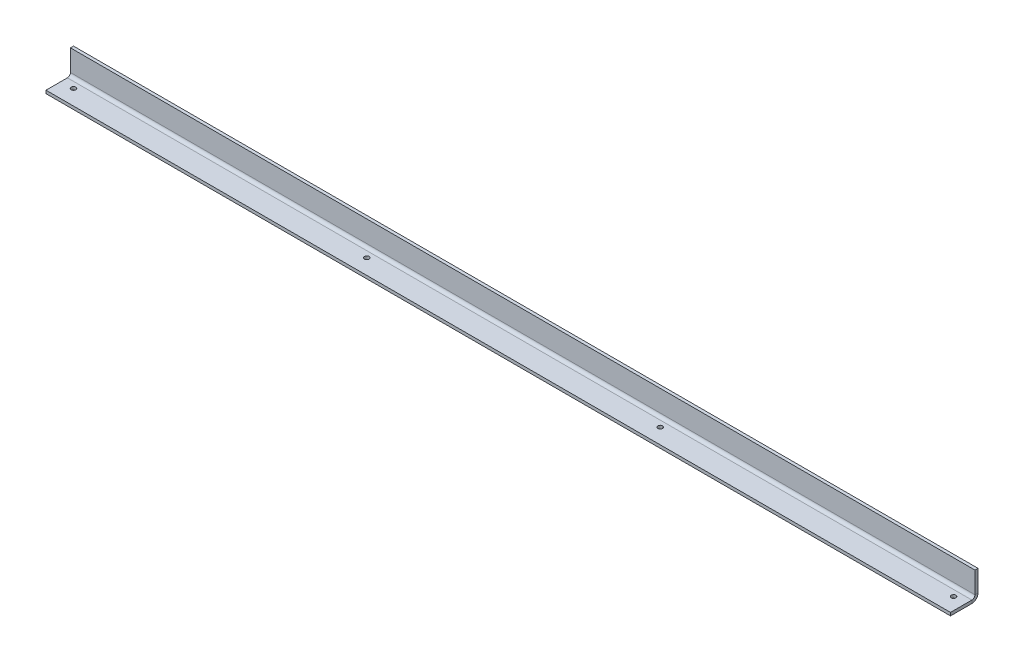
ISO-10303-21;
HEADER;
FILE_DESCRIPTION(('STEP AP214'),'2;1');
FILE_NAME('part.step','',(''),(''),'','','');
FILE_SCHEMA(('AUTOMOTIVE_DESIGN { 1 0 10303 214 1 1 1 1 }'));
ENDSEC;
DATA;
#1=APPLICATION_CONTEXT('core data for automotive mechanical design processes');
#2=APPLICATION_PROTOCOL_DEFINITION('international standard','automotive_design',2000,#1);
#3=PRODUCT_CONTEXT('',#1,'mechanical');
#4=PRODUCT('Part','Part','',(#3));
#5=PRODUCT_RELATED_PRODUCT_CATEGORY('part','',(#4));
#6=PRODUCT_DEFINITION_FORMATION('','',#4);
#7=PRODUCT_DEFINITION_CONTEXT('part definition',#1,'design');
#8=PRODUCT_DEFINITION('design','',#6,#7);
#9=PRODUCT_DEFINITION_SHAPE('','',#8);
#10=(LENGTH_UNIT() NAMED_UNIT(*) SI_UNIT(.MILLI.,.METRE.));
#11=(NAMED_UNIT(*) PLANE_ANGLE_UNIT() SI_UNIT($,.RADIAN.));
#12=(NAMED_UNIT(*) SI_UNIT($,.STERADIAN.) SOLID_ANGLE_UNIT());
#13=UNCERTAINTY_MEASURE_WITH_UNIT(LENGTH_MEASURE(1.E-05),#10,'distance_accuracy_value','');
#14=(GEOMETRIC_REPRESENTATION_CONTEXT(3) GLOBAL_UNCERTAINTY_ASSIGNED_CONTEXT((#13)) GLOBAL_UNIT_ASSIGNED_CONTEXT((#10,
#11,#12)) REPRESENTATION_CONTEXT('',''));
#15=CARTESIAN_POINT('',(0.,0.,0.));
#16=DIRECTION('',(0.,0.,1.));
#17=DIRECTION('',(1.,0.,0.));
#18=AXIS2_PLACEMENT_3D('',#15,#16,#17);
#19=CARTESIAN_POINT('',(457.2,0.,-1.58750000000007));
#20=DIRECTION('',(0.,1.,0.));
#21=DIRECTION('',(0.,0.,1.));
#22=AXIS2_PLACEMENT_3D('',#19,#20,#21);
#23=CYLINDRICAL_SURFACE('',#22,2.42569999999998);
#24=CARTESIAN_POINT('',(457.2,-3.17500000000004,-1.58750000000007));
#25=DIRECTION('',(0.,1.,0.));
#26=DIRECTION('',(0.,0.,1.));
#27=AXIS2_PLACEMENT_3D('',#24,#25,#26);
#28=CIRCLE('',#27,2.42569999999998);
#29=CARTESIAN_POINT('',(457.2,-3.17500000000004,0.8381999999999));
#30=VERTEX_POINT('',#29);
#31=EDGE_CURVE('E79',#30,#30,#28,.T.);
#32=ORIENTED_EDGE('',*,*,#31,.F.);
#33=EDGE_LOOP('',(#32));
#34=FACE_BOUND('',#33,.T.);
#35=CARTESIAN_POINT('',(457.2,0.,-1.58750000000007));
#36=DIRECTION('',(0.,1.,0.));
#37=DIRECTION('',(0.,0.,1.));
#38=AXIS2_PLACEMENT_3D('',#35,#36,#37);
#39=CIRCLE('',#38,2.42569999999998);
#40=CARTESIAN_POINT('',(457.2,0.,0.8381999999999));
#41=VERTEX_POINT('',#40);
#42=EDGE_CURVE('E15',#41,#41,#39,.T.);
#43=ORIENTED_EDGE('',*,*,#42,.T.);
#44=EDGE_LOOP('',(#43));
#45=FACE_BOUND('',#44,.T.);
#46=ADVANCED_FACE('F72',(#34,#45),#23,.F.);
#47=CARTESIAN_POINT('',(152.4,0.,-1.58750000000007));
#48=DIRECTION('',(0.,1.,0.));
#49=DIRECTION('',(0.,0.,1.));
#50=AXIS2_PLACEMENT_3D('',#47,#48,#49);
#51=CYLINDRICAL_SURFACE('',#50,2.42569999999998);
#52=CARTESIAN_POINT('',(152.4,-3.17500000000004,-1.58750000000007));
#53=DIRECTION('',(0.,1.,0.));
#54=DIRECTION('',(0.,0.,1.));
#55=AXIS2_PLACEMENT_3D('',#52,#53,#54);
#56=CIRCLE('',#55,2.42569999999998);
#57=CARTESIAN_POINT('',(152.4,-3.17500000000004,0.8381999999999));
#58=VERTEX_POINT('',#57);
#59=EDGE_CURVE('E113',#58,#58,#56,.T.);
#60=ORIENTED_EDGE('',*,*,#59,.F.);
#61=EDGE_LOOP('',(#60));
#62=FACE_BOUND('',#61,.T.);
#63=CARTESIAN_POINT('',(152.4,0.,-1.58750000000007));
#64=DIRECTION('',(0.,1.,0.));
#65=DIRECTION('',(0.,0.,1.));
#66=AXIS2_PLACEMENT_3D('',#63,#64,#65);
#67=CIRCLE('',#66,2.42569999999998);
#68=CARTESIAN_POINT('',(152.4,0.,0.8381999999999));
#69=VERTEX_POINT('',#68);
#70=EDGE_CURVE('E136',#69,#69,#67,.T.);
#71=ORIENTED_EDGE('',*,*,#70,.T.);
#72=EDGE_LOOP('',(#71));
#73=FACE_BOUND('',#72,.T.);
#74=ADVANCED_FACE('F145',(#62,#73),#51,.F.);
#75=CARTESIAN_POINT('',(-469.9,-3.17500000000004,14.2875));
#76=DIRECTION('',(-1.,0.,0.));
#77=DIRECTION('',(0.,0.,1.));
#78=AXIS2_PLACEMENT_3D('',#75,#76,#77);
#79=PLANE('',#78);
#80=DIRECTION('',(0.,0.,1.));
#81=VECTOR('',#80,1.);
#82=CARTESIAN_POINT('',(-469.9,0.,14.2875));
#83=LINE('',#82,#81);
#84=CARTESIAN_POINT('',(-469.9,0.,-7.93749999999993));
#85=VERTEX_POINT('',#84);
#86=CARTESIAN_POINT('',(-469.9,0.,14.2875));
#87=VERTEX_POINT('',#86);
#88=EDGE_CURVE('E126',#85,#87,#83,.T.);
#89=ORIENTED_EDGE('',*,*,#88,.F.);
#90=DIRECTION('',(0.,-1.,0.));
#91=VECTOR('',#90,1.);
#92=CARTESIAN_POINT('',(-469.9,0.,-7.93749999999993));
#93=LINE('',#92,#91);
#94=CARTESIAN_POINT('',(-469.9,-3.17500000000004,-7.93749999999993));
#95=VERTEX_POINT('',#94);
#96=EDGE_CURVE('E391',#85,#95,#93,.T.);
#97=ORIENTED_EDGE('',*,*,#96,.T.);
#98=DIRECTION('',(0.,0.,1.));
#99=VECTOR('',#98,1.);
#100=CARTESIAN_POINT('',(-469.9,-3.17500000000004,14.2875));
#101=LINE('',#100,#99);
#102=CARTESIAN_POINT('',(-469.9,-3.17500000000004,14.2875));
#103=VERTEX_POINT('',#102);
#104=EDGE_CURVE('E122',#95,#103,#101,.T.);
#105=ORIENTED_EDGE('',*,*,#104,.T.);
#106=DIRECTION('',(0.,1.,0.));
#107=VECTOR('',#106,1.);
#108=CARTESIAN_POINT('',(-469.9,-3.17500000000004,14.2875));
#109=LINE('',#108,#107);
#110=EDGE_CURVE('E114',#103,#87,#109,.T.);
#111=ORIENTED_EDGE('',*,*,#110,.T.);
#112=EDGE_LOOP('',(#89,#97,#105,#111));
#113=FACE_BOUND('',#112,.T.);
#114=ADVANCED_FACE('F156',(#113),#79,.T.);
#115=CARTESIAN_POINT('',(0.,-3.17500000000004,0.));
#116=DIRECTION('',(0.,1.,0.));
#117=DIRECTION('',(0.,0.,1.));
#118=AXIS2_PLACEMENT_3D('',#115,#116,#117);
#119=PLANE('',#118);
#120=CARTESIAN_POINT('',(-152.4,-3.17500000000004,-1.58750000000007));
#121=DIRECTION('',(0.,1.,0.));
#122=DIRECTION('',(0.,0.,1.));
#123=AXIS2_PLACEMENT_3D('',#120,#121,#122);
#124=CIRCLE('',#123,2.42569999999998);
#125=CARTESIAN_POINT('',(-152.4,-3.17500000000004,0.8381999999999));
#126=VERTEX_POINT('',#125);
#127=EDGE_CURVE('E335',#126,#126,#124,.T.);
#128=ORIENTED_EDGE('',*,*,#127,.T.);
#129=EDGE_LOOP('',(#128));
#130=FACE_BOUND('',#129,.T.);
#131=CARTESIAN_POINT('',(-457.2,-3.17500000000004,-1.58749999999996));
#132=DIRECTION('',(0.,1.,0.));
#133=DIRECTION('',(0.,0.,1.));
#134=AXIS2_PLACEMENT_3D('',#131,#132,#133);
#135=CIRCLE('',#134,2.42569999999998);
#136=CARTESIAN_POINT('',(-457.2,-3.17500000000004,0.838200000000011));
#137=VERTEX_POINT('',#136);
#138=EDGE_CURVE('E341',#137,#137,#135,.T.);
#139=ORIENTED_EDGE('',*,*,#138,.T.);
#140=EDGE_LOOP('',(#139));
#141=FACE_BOUND('',#140,.T.);
#142=DIRECTION('',(-1.,0.,0.));
#143=VECTOR('',#142,1.);
#144=CARTESIAN_POINT('',(-469.9,-3.17500000000004,-7.93749999999993));
#145=LINE('',#144,#143);
#146=CARTESIAN_POINT('',(469.9,-3.17500000000004,-7.93749999999993));
#147=VERTEX_POINT('',#146);
#148=EDGE_CURVE('E384',#95,#147,#145,.F.);
#149=ORIENTED_EDGE('',*,*,#148,.T.);
#150=DIRECTION('',(0.,0.,-1.));
#151=VECTOR('',#150,1.);
#152=CARTESIAN_POINT('',(469.9,-3.17500000000004,14.2874999999999));
#153=LINE('',#152,#151);
#154=CARTESIAN_POINT('',(469.9,-3.17500000000004,14.2874999999999));
#155=VERTEX_POINT('',#154);
#156=EDGE_CURVE('E133',#155,#147,#153,.T.);
#157=ORIENTED_EDGE('',*,*,#156,.F.);
#158=DIRECTION('',(1.,0.,0.));
#159=VECTOR('',#158,1.);
#160=CARTESIAN_POINT('',(469.9,-3.17500000000004,14.2874999999999));
#161=LINE('',#160,#159);
#162=EDGE_CURVE('E112',#103,#155,#161,.T.);
#163=ORIENTED_EDGE('',*,*,#162,.F.);
#164=ORIENTED_EDGE('',*,*,#104,.F.);
#165=EDGE_LOOP('',(#149,#157,#163,#164));
#166=FACE_BOUND('',#165,.T.);
#167=ORIENTED_EDGE('',*,*,#59,.T.);
#168=EDGE_LOOP('',(#167));
#169=FACE_BOUND('',#168,.T.);
#170=ORIENTED_EDGE('',*,*,#31,.T.);
#171=EDGE_LOOP('',(#170));
#172=FACE_BOUND('',#171,.T.);
#173=ADVANCED_FACE('F141',(#130,#141,#166,#169,#172),#119,.F.);
#174=CARTESIAN_POINT('',(0.,0.,0.));
#175=DIRECTION('',(0.,1.,0.));
#176=DIRECTION('',(0.,0.,1.));
#177=AXIS2_PLACEMENT_3D('',#174,#175,#176);
#178=PLANE('',#177);
#179=CARTESIAN_POINT('',(-152.4,0.,-1.58750000000007));
#180=DIRECTION('',(0.,1.,0.));
#181=DIRECTION('',(0.,0.,1.));
#182=AXIS2_PLACEMENT_3D('',#179,#180,#181);
#183=CIRCLE('',#182,2.42569999999998);
#184=CARTESIAN_POINT('',(-152.4,0.,0.8381999999999));
#185=VERTEX_POINT('',#184);
#186=EDGE_CURVE('E337',#185,#185,#183,.T.);
#187=ORIENTED_EDGE('',*,*,#186,.F.);
#188=EDGE_LOOP('',(#187));
#189=FACE_BOUND('',#188,.T.);
#190=CARTESIAN_POINT('',(-457.2,0.,-1.58749999999996));
#191=DIRECTION('',(0.,1.,0.));
#192=DIRECTION('',(0.,0.,1.));
#193=AXIS2_PLACEMENT_3D('',#190,#191,#192);
#194=CIRCLE('',#193,2.42569999999998);
#195=CARTESIAN_POINT('',(-457.2,0.,0.838200000000011));
#196=VERTEX_POINT('',#195);
#197=EDGE_CURVE('E338',#196,#196,#194,.T.);
#198=ORIENTED_EDGE('',*,*,#197,.F.);
#199=EDGE_LOOP('',(#198));
#200=FACE_BOUND('',#199,.T.);
#201=DIRECTION('',(0.,0.,-1.));
#202=VECTOR('',#201,1.);
#203=CARTESIAN_POINT('',(469.9,0.,14.2874999999999));
#204=LINE('',#203,#202);
#205=CARTESIAN_POINT('',(469.9,0.,14.2874999999999));
#206=VERTEX_POINT('',#205);
#207=CARTESIAN_POINT('',(469.9,0.,-7.93749999999993));
#208=VERTEX_POINT('',#207);
#209=EDGE_CURVE('E117',#206,#208,#204,.T.);
#210=ORIENTED_EDGE('',*,*,#209,.T.);
#211=DIRECTION('',(-1.,0.,0.));
#212=VECTOR('',#211,1.);
#213=CARTESIAN_POINT('',(-469.9,0.,-7.93749999999993));
#214=LINE('',#213,#212);
#215=EDGE_CURVE('E86',#85,#208,#214,.F.);
#216=ORIENTED_EDGE('',*,*,#215,.F.);
#217=ORIENTED_EDGE('',*,*,#88,.T.);
#218=DIRECTION('',(1.,0.,0.));
#219=VECTOR('',#218,1.);
#220=CARTESIAN_POINT('',(469.9,0.,14.2874999999999));
#221=LINE('',#220,#219);
#222=EDGE_CURVE('E110',#87,#206,#221,.T.);
#223=ORIENTED_EDGE('',*,*,#222,.T.);
#224=EDGE_LOOP('',(#210,#216,#217,#223));
#225=FACE_BOUND('',#224,.T.);
#226=ORIENTED_EDGE('',*,*,#70,.F.);
#227=EDGE_LOOP('',(#226));
#228=FACE_BOUND('',#227,.T.);
#229=ORIENTED_EDGE('',*,*,#42,.F.);
#230=EDGE_LOOP('',(#229));
#231=FACE_BOUND('',#230,.T.);
#232=ADVANCED_FACE('F124',(#189,#200,#225,#228,#231),#178,.T.);
#233=CARTESIAN_POINT('',(469.9,-3.17500000000004,14.2874999999999));
#234=DIRECTION('',(1.,0.,0.));
#235=DIRECTION('',(0.,0.,-1.));
#236=AXIS2_PLACEMENT_3D('',#233,#234,#235);
#237=PLANE('',#236);
#238=DIRECTION('',(0.,-1.,0.));
#239=VECTOR('',#238,1.);
#240=CARTESIAN_POINT('',(469.9,0.,-7.93749999999993));
#241=LINE('',#240,#239);
#242=EDGE_CURVE('E121',#208,#147,#241,.T.);
#243=ORIENTED_EDGE('',*,*,#242,.F.);
#244=ORIENTED_EDGE('',*,*,#209,.F.);
#245=DIRECTION('',(0.,1.,0.));
#246=VECTOR('',#245,1.);
#247=CARTESIAN_POINT('',(469.9,-3.17500000000004,14.2874999999999));
#248=LINE('',#247,#246);
#249=EDGE_CURVE('E95',#155,#206,#248,.T.);
#250=ORIENTED_EDGE('',*,*,#249,.F.);
#251=ORIENTED_EDGE('',*,*,#156,.T.);
#252=EDGE_LOOP('',(#243,#244,#250,#251));
#253=FACE_BOUND('',#252,.T.);
#254=ADVANCED_FACE('F118',(#253),#237,.T.);
#255=CARTESIAN_POINT('',(469.9,-3.17500000000004,14.2874999999999));
#256=DIRECTION('',(0.,0.,1.));
#257=DIRECTION('',(1.,0.,0.));
#258=AXIS2_PLACEMENT_3D('',#255,#256,#257);
#259=PLANE('',#258);
#260=ORIENTED_EDGE('',*,*,#222,.F.);
#261=ORIENTED_EDGE('',*,*,#110,.F.);
#262=ORIENTED_EDGE('',*,*,#162,.T.);
#263=ORIENTED_EDGE('',*,*,#249,.T.);
#264=EDGE_LOOP('',(#260,#261,#262,#263));
#265=FACE_BOUND('',#264,.T.);
#266=ADVANCED_FACE('F107',(#265),#259,.T.);
#267=CARTESIAN_POINT('',(469.9,3.17499999999993,-7.93750000000004));
#268=DIRECTION('',(1.,0.,0.));
#269=DIRECTION('',(0.,0.,-1.));
#270=AXIS2_PLACEMENT_3D('',#267,#268,#269);
#271=PLANE('',#270);
#272=DIRECTION('',(0.,0.,-1.));
#273=VECTOR('',#272,1.);
#274=CARTESIAN_POINT('',(469.9,3.17500000000004,-14.2875000000001));
#275=LINE('',#274,#273);
#276=CARTESIAN_POINT('',(469.9,3.17499999999993,-11.1125));
#277=VERTEX_POINT('',#276);
#278=CARTESIAN_POINT('',(469.9,3.17499999999993,-14.2875));
#279=VERTEX_POINT('',#278);
#280=EDGE_CURVE('E347',#277,#279,#275,.T.);
#281=ORIENTED_EDGE('',*,*,#280,.F.);
#282=CARTESIAN_POINT('',(469.9,3.17499999999993,-7.93750000000004));
#283=DIRECTION('',(-1.,0.,0.));
#284=DIRECTION('',(0.,0.,1.));
#285=AXIS2_PLACEMENT_3D('',#282,#283,#284);
#286=CIRCLE('',#285,3.175);
#287=EDGE_CURVE('E394',#208,#277,#286,.F.);
#288=ORIENTED_EDGE('',*,*,#287,.F.);
#289=ORIENTED_EDGE('',*,*,#242,.T.);
#290=CARTESIAN_POINT('',(469.9,3.17499999999993,-7.93750000000004));
#291=DIRECTION('',(-1.,0.,0.));
#292=DIRECTION('',(0.,0.,1.));
#293=AXIS2_PLACEMENT_3D('',#290,#291,#292);
#294=CIRCLE('',#293,6.35);
#295=EDGE_CURVE('E387',#147,#279,#294,.F.);
#296=ORIENTED_EDGE('',*,*,#295,.T.);
#297=EDGE_LOOP('',(#281,#288,#289,#296));
#298=FACE_BOUND('',#297,.T.);
#299=ADVANCED_FACE('F165',(#298),#271,.T.);
#300=CARTESIAN_POINT('',(-469.9,3.17499999999993,-7.93750000000004));
#301=DIRECTION('',(1.,0.,0.));
#302=DIRECTION('',(0.,0.,-1.));
#303=AXIS2_PLACEMENT_3D('',#300,#301,#302);
#304=PLANE('',#303);
#305=CARTESIAN_POINT('',(-469.9,3.17499999999993,-7.93750000000004));
#306=DIRECTION('',(-1.,0.,0.));
#307=DIRECTION('',(0.,0.,1.));
#308=AXIS2_PLACEMENT_3D('',#305,#306,#307);
#309=CIRCLE('',#308,3.175);
#310=CARTESIAN_POINT('',(-469.9,3.17499999999993,-11.1125));
#311=VERTEX_POINT('',#310);
#312=EDGE_CURVE('E351',#311,#85,#309,.T.);
#313=ORIENTED_EDGE('',*,*,#312,.F.);
#314=DIRECTION('',(0.,0.,-1.));
#315=VECTOR('',#314,1.);
#316=CARTESIAN_POINT('',(-469.9,3.17500000000004,-11.1125));
#317=LINE('',#316,#315);
#318=CARTESIAN_POINT('',(-469.9,3.17500000000004,-14.2875));
#319=VERTEX_POINT('',#318);
#320=EDGE_CURVE('E376',#311,#319,#317,.T.);
#321=ORIENTED_EDGE('',*,*,#320,.T.);
#322=CARTESIAN_POINT('',(-469.9,3.17499999999993,-7.93750000000004));
#323=DIRECTION('',(-1.,0.,0.));
#324=DIRECTION('',(0.,0.,1.));
#325=AXIS2_PLACEMENT_3D('',#322,#323,#324);
#326=CIRCLE('',#325,6.35);
#327=EDGE_CURVE('E388',#319,#95,#326,.T.);
#328=ORIENTED_EDGE('',*,*,#327,.T.);
#329=ORIENTED_EDGE('',*,*,#96,.F.);
#330=EDGE_LOOP('',(#313,#321,#328,#329));
#331=FACE_BOUND('',#330,.T.);
#332=ADVANCED_FACE('F213',(#331),#304,.F.);
#333=CARTESIAN_POINT('',(-469.9,3.17499999999993,-7.93750000000004));
#334=DIRECTION('',(-1.,0.,0.));
#335=DIRECTION('',(0.,0.,-1.));
#336=AXIS2_PLACEMENT_3D('',#333,#334,#335);
#337=CYLINDRICAL_SURFACE('',#336,6.35);
#338=ORIENTED_EDGE('',*,*,#148,.F.);
#339=ORIENTED_EDGE('',*,*,#327,.F.);
#340=DIRECTION('',(-1.,0.,0.));
#341=VECTOR('',#340,1.);
#342=CARTESIAN_POINT('',(0.,3.17500000000004,-14.2875));
#343=LINE('',#342,#341);
#344=EDGE_CURVE('E373',#279,#319,#343,.T.);
#345=ORIENTED_EDGE('',*,*,#344,.F.);
#346=ORIENTED_EDGE('',*,*,#295,.F.);
#347=EDGE_LOOP('',(#338,#339,#345,#346));
#348=FACE_BOUND('',#347,.T.);
#349=ADVANCED_FACE('F225',(#348),#337,.T.);
#350=CARTESIAN_POINT('',(-469.9,3.17499999999993,-7.93750000000004));
#351=DIRECTION('',(-1.,0.,0.));
#352=DIRECTION('',(0.,0.,-1.));
#353=AXIS2_PLACEMENT_3D('',#350,#351,#352);
#354=CYLINDRICAL_SURFACE('',#353,3.175);
#355=ORIENTED_EDGE('',*,*,#215,.T.);
#356=ORIENTED_EDGE('',*,*,#287,.T.);
#357=DIRECTION('',(1.,0.,0.));
#358=VECTOR('',#357,1.);
#359=CARTESIAN_POINT('',(469.9,3.17500000000004,-11.1125));
#360=LINE('',#359,#358);
#361=EDGE_CURVE('E379',#277,#311,#360,.F.);
#362=ORIENTED_EDGE('',*,*,#361,.T.);
#363=ORIENTED_EDGE('',*,*,#312,.T.);
#364=EDGE_LOOP('',(#355,#356,#362,#363));
#365=FACE_BOUND('',#364,.T.);
#366=ADVANCED_FACE('F235',(#365),#354,.F.);
#367=CARTESIAN_POINT('',(-469.9,0.,-14.2875));
#368=DIRECTION('',(-1.,0.,0.));
#369=DIRECTION('',(0.,0.,1.));
#370=AXIS2_PLACEMENT_3D('',#367,#368,#369);
#371=PLANE('',#370);
#372=DIRECTION('',(0.,-1.,0.));
#373=VECTOR('',#372,1.);
#374=CARTESIAN_POINT('',(-469.9,0.,-14.2875));
#375=LINE('',#374,#373);
#376=CARTESIAN_POINT('',(-469.9,25.4,-14.2875));
#377=VERTEX_POINT('',#376);
#378=EDGE_CURVE('E355',#377,#319,#375,.T.);
#379=ORIENTED_EDGE('',*,*,#378,.T.);
#380=ORIENTED_EDGE('',*,*,#320,.F.);
#381=DIRECTION('',(0.,1.,0.));
#382=VECTOR('',#381,1.);
#383=CARTESIAN_POINT('',(-469.9,0.,-11.1125));
#384=LINE('',#383,#382);
#385=CARTESIAN_POINT('',(-469.9,25.4,-11.1125));
#386=VERTEX_POINT('',#385);
#387=EDGE_CURVE('E364',#386,#311,#384,.F.);
#388=ORIENTED_EDGE('',*,*,#387,.F.);
#389=DIRECTION('',(0.,0.,1.));
#390=VECTOR('',#389,1.);
#391=CARTESIAN_POINT('',(-469.9,25.4,-14.2875));
#392=LINE('',#391,#390);
#393=EDGE_CURVE('E348',#377,#386,#392,.T.);
#394=ORIENTED_EDGE('',*,*,#393,.F.);
#395=EDGE_LOOP('',(#379,#380,#388,#394));
#396=FACE_BOUND('',#395,.T.);
#397=ADVANCED_FACE('F246',(#396),#371,.T.);
#398=CARTESIAN_POINT('',(469.9,25.4,-14.2875));
#399=DIRECTION('',(1.,0.,0.));
#400=DIRECTION('',(0.,0.,-1.));
#401=AXIS2_PLACEMENT_3D('',#398,#399,#400);
#402=PLANE('',#401);
#403=DIRECTION('',(0.,-1.,0.));
#404=VECTOR('',#403,1.);
#405=CARTESIAN_POINT('',(469.9,0.,-11.1125));
#406=LINE('',#405,#404);
#407=CARTESIAN_POINT('',(469.9,25.4,-11.1125));
#408=VERTEX_POINT('',#407);
#409=EDGE_CURVE('E370',#277,#408,#406,.F.);
#410=ORIENTED_EDGE('',*,*,#409,.F.);
#411=ORIENTED_EDGE('',*,*,#280,.T.);
#412=DIRECTION('',(0.,1.,0.));
#413=VECTOR('',#412,1.);
#414=CARTESIAN_POINT('',(469.9,25.4,-14.2875));
#415=LINE('',#414,#413);
#416=CARTESIAN_POINT('',(469.9,25.4,-14.2875));
#417=VERTEX_POINT('',#416);
#418=EDGE_CURVE('E361',#279,#417,#415,.T.);
#419=ORIENTED_EDGE('',*,*,#418,.T.);
#420=DIRECTION('',(0.,0.,1.));
#421=VECTOR('',#420,1.);
#422=CARTESIAN_POINT('',(469.9,25.4,-14.2875));
#423=LINE('',#422,#421);
#424=EDGE_CURVE('E352',#417,#408,#423,.T.);
#425=ORIENTED_EDGE('',*,*,#424,.T.);
#426=EDGE_LOOP('',(#410,#411,#419,#425));
#427=FACE_BOUND('',#426,.T.);
#428=ADVANCED_FACE('F257',(#427),#402,.T.);
#429=CARTESIAN_POINT('',(0.,0.,-14.2875));
#430=DIRECTION('',(0.,0.,-1.));
#431=DIRECTION('',(-1.,0.,0.));
#432=AXIS2_PLACEMENT_3D('',#429,#430,#431);
#433=PLANE('',#432);
#434=ORIENTED_EDGE('',*,*,#418,.F.);
#435=ORIENTED_EDGE('',*,*,#344,.T.);
#436=ORIENTED_EDGE('',*,*,#378,.F.);
#437=DIRECTION('',(-1.,0.,0.));
#438=VECTOR('',#437,1.);
#439=CARTESIAN_POINT('',(-469.9,25.4,-14.2875));
#440=LINE('',#439,#438);
#441=EDGE_CURVE('E358',#417,#377,#440,.T.);
#442=ORIENTED_EDGE('',*,*,#441,.F.);
#443=EDGE_LOOP('',(#434,#435,#436,#442));
#444=FACE_BOUND('',#443,.T.);
#445=ADVANCED_FACE('F268',(#444),#433,.T.);
#446=CARTESIAN_POINT('',(0.,0.,-11.1125));
#447=DIRECTION('',(0.,0.,-1.));
#448=DIRECTION('',(-1.,0.,0.));
#449=AXIS2_PLACEMENT_3D('',#446,#447,#448);
#450=PLANE('',#449);
#451=ORIENTED_EDGE('',*,*,#361,.F.);
#452=ORIENTED_EDGE('',*,*,#409,.T.);
#453=DIRECTION('',(1.,0.,0.));
#454=VECTOR('',#453,1.);
#455=CARTESIAN_POINT('',(0.,25.4,-11.1125));
#456=LINE('',#455,#454);
#457=EDGE_CURVE('E367',#408,#386,#456,.F.);
#458=ORIENTED_EDGE('',*,*,#457,.T.);
#459=ORIENTED_EDGE('',*,*,#387,.T.);
#460=EDGE_LOOP('',(#451,#452,#458,#459));
#461=FACE_BOUND('',#460,.T.);
#462=ADVANCED_FACE('F279',(#461),#450,.F.);
#463=CARTESIAN_POINT('',(-469.9,25.4,-14.2875));
#464=DIRECTION('',(0.,1.,0.));
#465=DIRECTION('',(0.,0.,1.));
#466=AXIS2_PLACEMENT_3D('',#463,#464,#465);
#467=PLANE('',#466);
#468=ORIENTED_EDGE('',*,*,#457,.F.);
#469=ORIENTED_EDGE('',*,*,#424,.F.);
#470=ORIENTED_EDGE('',*,*,#441,.T.);
#471=ORIENTED_EDGE('',*,*,#393,.T.);
#472=EDGE_LOOP('',(#468,#469,#470,#471));
#473=FACE_BOUND('',#472,.T.);
#474=ADVANCED_FACE('F290',(#473),#467,.T.);
#475=CARTESIAN_POINT('',(-457.2,0.,-1.58749999999996));
#476=DIRECTION('',(0.,1.,0.));
#477=DIRECTION('',(0.,0.,1.));
#478=AXIS2_PLACEMENT_3D('',#475,#476,#477);
#479=CYLINDRICAL_SURFACE('',#478,2.42569999999998);
#480=ORIENTED_EDGE('',*,*,#138,.F.);
#481=EDGE_LOOP('',(#480));
#482=FACE_BOUND('',#481,.T.);
#483=ORIENTED_EDGE('',*,*,#197,.T.);
#484=EDGE_LOOP('',(#483));
#485=FACE_BOUND('',#484,.T.);
#486=ADVANCED_FACE('F301',(#482,#485),#479,.F.);
#487=CARTESIAN_POINT('',(-152.4,0.,-1.58750000000007));
#488=DIRECTION('',(0.,1.,0.));
#489=DIRECTION('',(0.,0.,1.));
#490=AXIS2_PLACEMENT_3D('',#487,#488,#489);
#491=CYLINDRICAL_SURFACE('',#490,2.42569999999998);
#492=ORIENTED_EDGE('',*,*,#127,.F.);
#493=EDGE_LOOP('',(#492));
#494=FACE_BOUND('',#493,.T.);
#495=ORIENTED_EDGE('',*,*,#186,.T.);
#496=EDGE_LOOP('',(#495));
#497=FACE_BOUND('',#496,.T.);
#498=ADVANCED_FACE('F312',(#494,#497),#491,.F.);
#499=CLOSED_SHELL('',(#46,#74,#114,#173,#232,#254,#266,#299,#332,#349,#366,#397,#428,#445,#462,
#474,#486,#498));
#500=MANIFOLD_SOLID_BREP('B2',#499);
#501=ADVANCED_BREP_SHAPE_REPRESENTATION('',(#18,#500),#14);
#502=SHAPE_DEFINITION_REPRESENTATION(#9,#501);
ENDSEC;
END-ISO-10303-21;
